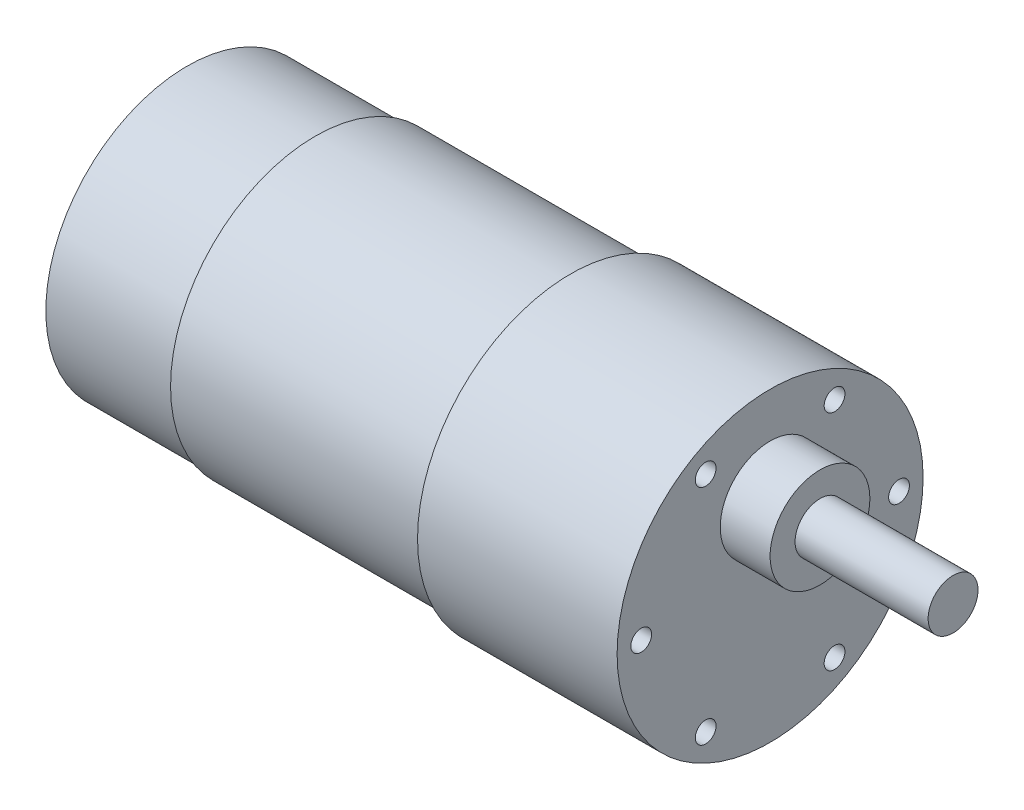
ISO-10303-21;
HEADER;
FILE_DESCRIPTION(('STEP AP214'),'2;1');
FILE_NAME('part.step','',(''),(''),'','','');
FILE_SCHEMA(('AUTOMOTIVE_DESIGN { 1 0 10303 214 1 1 1 1 }'));
ENDSEC;
DATA;
#1=APPLICATION_CONTEXT('core data for automotive mechanical design processes');
#2=APPLICATION_PROTOCOL_DEFINITION('international standard','automotive_design',2000,#1);
#3=PRODUCT_CONTEXT('',#1,'mechanical');
#4=PRODUCT('Part','Part','',(#3));
#5=PRODUCT_RELATED_PRODUCT_CATEGORY('part','',(#4));
#6=PRODUCT_DEFINITION_FORMATION('','',#4);
#7=PRODUCT_DEFINITION_CONTEXT('part definition',#1,'design');
#8=PRODUCT_DEFINITION('design','',#6,#7);
#9=PRODUCT_DEFINITION_SHAPE('','',#8);
#10=(LENGTH_UNIT() NAMED_UNIT(*) SI_UNIT(.MILLI.,.METRE.));
#11=(NAMED_UNIT(*) PLANE_ANGLE_UNIT() SI_UNIT($,.RADIAN.));
#12=(NAMED_UNIT(*) SI_UNIT($,.STERADIAN.) SOLID_ANGLE_UNIT());
#13=UNCERTAINTY_MEASURE_WITH_UNIT(LENGTH_MEASURE(1.E-05),#10,'distance_accuracy_value','');
#14=(GEOMETRIC_REPRESENTATION_CONTEXT(3) GLOBAL_UNCERTAINTY_ASSIGNED_CONTEXT((#13)) GLOBAL_UNIT_ASSIGNED_CONTEXT((#10,
#11,#12)) REPRESENTATION_CONTEXT('',''));
#15=CARTESIAN_POINT('',(0.,0.,0.));
#16=DIRECTION('',(0.,0.,1.));
#17=DIRECTION('',(1.,0.,0.));
#18=AXIS2_PLACEMENT_3D('',#15,#16,#17);
#19=CARTESIAN_POINT('',(-24.,0.,0.));
#20=DIRECTION('',(1.,0.,0.));
#21=DIRECTION('',(0.,0.,-1.));
#22=AXIS2_PLACEMENT_3D('',#19,#20,#21);
#23=CYLINDRICAL_SURFACE('',#22,18.4);
#24=CARTESIAN_POINT('',(-24.,0.,0.));
#25=DIRECTION('',(1.,0.,0.));
#26=DIRECTION('',(0.,0.,-1.));
#27=AXIS2_PLACEMENT_3D('',#24,#25,#26);
#28=CIRCLE('',#27,18.4);
#29=CARTESIAN_POINT('',(-24.,0.,-18.4));
#30=VERTEX_POINT('',#29);
#31=EDGE_CURVE('E47',#30,#30,#28,.T.);
#32=ORIENTED_EDGE('',*,*,#31,.T.);
#33=EDGE_LOOP('',(#32));
#34=FACE_BOUND('',#33,.T.);
#35=CARTESIAN_POINT('',(0.,0.,0.));
#36=DIRECTION('',(1.,0.,0.));
#37=DIRECTION('',(0.,0.,-1.));
#38=AXIS2_PLACEMENT_3D('',#35,#36,#37);
#39=CIRCLE('',#38,18.4);
#40=CARTESIAN_POINT('',(0.,0.,-18.4));
#41=VERTEX_POINT('',#40);
#42=EDGE_CURVE('E37',#41,#41,#39,.T.);
#43=ORIENTED_EDGE('',*,*,#42,.F.);
#44=EDGE_LOOP('',(#43));
#45=FACE_BOUND('',#44,.T.);
#46=ADVANCED_FACE('F40',(#34,#45),#23,.T.);
#47=CARTESIAN_POINT('',(-24.,0.,0.));
#48=DIRECTION('',(1.,0.,0.));
#49=DIRECTION('',(0.,0.,-1.));
#50=AXIS2_PLACEMENT_3D('',#47,#48,#49);
#51=PLANE('',#50);
#52=CARTESIAN_POINT('',(-24.,0.,0.));
#53=DIRECTION('',(1.,0.,0.));
#54=DIRECTION('',(0.,0.,-1.));
#55=AXIS2_PLACEMENT_3D('',#52,#53,#54);
#56=CIRCLE('',#55,17.4);
#57=CARTESIAN_POINT('',(-24.,0.,-17.4));
#58=VERTEX_POINT('',#57);
#59=EDGE_CURVE('E61',#58,#58,#56,.T.);
#60=ORIENTED_EDGE('',*,*,#59,.T.);
#61=EDGE_LOOP('',(#60));
#62=FACE_BOUND('',#61,.T.);
#63=ORIENTED_EDGE('',*,*,#31,.F.);
#64=EDGE_LOOP('',(#63));
#65=FACE_BOUND('',#64,.T.);
#66=ADVANCED_FACE('F76',(#62,#65),#51,.F.);
#67=CARTESIAN_POINT('',(0.,0.,0.));
#68=DIRECTION('',(1.,0.,0.));
#69=DIRECTION('',(0.,0.,-1.));
#70=AXIS2_PLACEMENT_3D('',#67,#68,#69);
#71=PLANE('',#70);
#72=CARTESIAN_POINT('',(0.,0.,15.5));
#73=DIRECTION('',(1.,0.,0.));
#74=DIRECTION('',(0.,0.,-1.));
#75=AXIS2_PLACEMENT_3D('',#72,#73,#74);
#76=CIRCLE('',#75,1.25);
#77=CARTESIAN_POINT('',(0.,0.,14.25));
#78=VERTEX_POINT('',#77);
#79=EDGE_CURVE('E172',#78,#78,#76,.T.);
#80=ORIENTED_EDGE('',*,*,#79,.F.);
#81=EDGE_LOOP('',(#80));
#82=FACE_BOUND('',#81,.T.);
#83=CARTESIAN_POINT('',(0.,-13.4233937586588,7.75));
#84=DIRECTION('',(1.,0.,0.));
#85=DIRECTION('',(0.,0.,-1.));
#86=AXIS2_PLACEMENT_3D('',#83,#84,#85);
#87=CIRCLE('',#86,1.25);
#88=CARTESIAN_POINT('',(0.,-13.4233937586588,6.5));
#89=VERTEX_POINT('',#88);
#90=EDGE_CURVE('E181',#89,#89,#87,.T.);
#91=ORIENTED_EDGE('',*,*,#90,.F.);
#92=EDGE_LOOP('',(#91));
#93=FACE_BOUND('',#92,.T.);
#94=CARTESIAN_POINT('',(0.,-13.4233937586588,-7.75000000000001));
#95=DIRECTION('',(1.,0.,0.));
#96=DIRECTION('',(0.,0.,-1.));
#97=AXIS2_PLACEMENT_3D('',#94,#95,#96);
#98=CIRCLE('',#97,1.25);
#99=CARTESIAN_POINT('',(0.,-13.4233937586588,-9.00000000000001));
#100=VERTEX_POINT('',#99);
#101=EDGE_CURVE('E204',#100,#100,#98,.T.);
#102=ORIENTED_EDGE('',*,*,#101,.F.);
#103=EDGE_LOOP('',(#102));
#104=FACE_BOUND('',#103,.T.);
#105=CARTESIAN_POINT('',(0.,0.,-15.5));
#106=DIRECTION('',(1.,0.,0.));
#107=DIRECTION('',(0.,0.,-1.));
#108=AXIS2_PLACEMENT_3D('',#105,#106,#107);
#109=CIRCLE('',#108,1.25);
#110=CARTESIAN_POINT('',(0.,0.,-16.75));
#111=VERTEX_POINT('',#110);
#112=EDGE_CURVE('E197',#111,#111,#109,.T.);
#113=ORIENTED_EDGE('',*,*,#112,.F.);
#114=EDGE_LOOP('',(#113));
#115=FACE_BOUND('',#114,.T.);
#116=CARTESIAN_POINT('',(0.,13.4233937586588,-7.75));
#117=DIRECTION('',(1.,0.,0.));
#118=DIRECTION('',(0.,0.,-1.));
#119=AXIS2_PLACEMENT_3D('',#116,#117,#118);
#120=CIRCLE('',#119,1.25);
#121=CARTESIAN_POINT('',(0.,13.4233937586588,-9.));
#122=VERTEX_POINT('',#121);
#123=EDGE_CURVE('E195',#122,#122,#120,.T.);
#124=ORIENTED_EDGE('',*,*,#123,.F.);
#125=EDGE_LOOP('',(#124));
#126=FACE_BOUND('',#125,.T.);
#127=CARTESIAN_POINT('',(0.,13.4233937586588,7.75));
#128=DIRECTION('',(1.,0.,0.));
#129=DIRECTION('',(0.,0.,-1.));
#130=AXIS2_PLACEMENT_3D('',#127,#128,#129);
#131=CIRCLE('',#130,1.25);
#132=CARTESIAN_POINT('',(0.,13.4233937586588,6.5));
#133=VERTEX_POINT('',#132);
#134=EDGE_CURVE('E178',#133,#133,#131,.T.);
#135=ORIENTED_EDGE('',*,*,#134,.F.);
#136=EDGE_LOOP('',(#135));
#137=FACE_BOUND('',#136,.T.);
#138=CARTESIAN_POINT('',(0.,7.,0.));
#139=DIRECTION('',(1.,0.,0.));
#140=DIRECTION('',(0.,0.,-1.));
#141=AXIS2_PLACEMENT_3D('',#138,#139,#140);
#142=CIRCLE('',#141,6.);
#143=CARTESIAN_POINT('',(0.,7.,-6.));
#144=VERTEX_POINT('',#143);
#145=EDGE_CURVE('E42',#144,#144,#142,.T.);
#146=ORIENTED_EDGE('',*,*,#145,.F.);
#147=EDGE_LOOP('',(#146));
#148=FACE_BOUND('',#147,.T.);
#149=ORIENTED_EDGE('',*,*,#42,.T.);
#150=EDGE_LOOP('',(#149));
#151=FACE_BOUND('',#150,.T.);
#152=ADVANCED_FACE('F74',(#82,#93,#104,#115,#126,#137,#148,#151),#71,.T.);
#153=CARTESIAN_POINT('',(-54.7,0.,0.));
#154=DIRECTION('',(1.,0.,0.));
#155=DIRECTION('',(0.,0.,-1.));
#156=AXIS2_PLACEMENT_3D('',#153,#154,#155);
#157=CYLINDRICAL_SURFACE('',#156,17.4);
#158=CARTESIAN_POINT('',(-54.7,0.,0.));
#159=DIRECTION('',(1.,0.,0.));
#160=DIRECTION('',(0.,0.,-1.));
#161=AXIS2_PLACEMENT_3D('',#158,#159,#160);
#162=CIRCLE('',#161,17.4);
#163=CARTESIAN_POINT('',(-54.7,0.,-17.4));
#164=VERTEX_POINT('',#163);
#165=EDGE_CURVE('E62',#164,#164,#162,.T.);
#166=ORIENTED_EDGE('',*,*,#165,.T.);
#167=EDGE_LOOP('',(#166));
#168=FACE_BOUND('',#167,.T.);
#169=ORIENTED_EDGE('',*,*,#59,.F.);
#170=EDGE_LOOP('',(#169));
#171=FACE_BOUND('',#170,.T.);
#172=ADVANCED_FACE('F88',(#168,#171),#157,.T.);
#173=CARTESIAN_POINT('',(-54.7,0.,0.));
#174=DIRECTION('',(1.,0.,0.));
#175=DIRECTION('',(0.,0.,-1.));
#176=AXIS2_PLACEMENT_3D('',#173,#174,#175);
#177=PLANE('',#176);
#178=CARTESIAN_POINT('',(-54.7,0.,0.));
#179=DIRECTION('',(1.,0.,0.));
#180=DIRECTION('',(0.,0.,-1.));
#181=AXIS2_PLACEMENT_3D('',#178,#179,#180);
#182=CIRCLE('',#181,17.);
#183=CARTESIAN_POINT('',(-54.7,0.,-17.));
#184=VERTEX_POINT('',#183);
#185=EDGE_CURVE('E60',#184,#184,#182,.T.);
#186=ORIENTED_EDGE('',*,*,#185,.T.);
#187=EDGE_LOOP('',(#186));
#188=FACE_BOUND('',#187,.T.);
#189=ORIENTED_EDGE('',*,*,#165,.F.);
#190=EDGE_LOOP('',(#189));
#191=FACE_BOUND('',#190,.T.);
#192=ADVANCED_FACE('F93',(#188,#191),#177,.F.);
#193=CARTESIAN_POINT('',(-70.1,0.,0.));
#194=DIRECTION('',(1.,0.,0.));
#195=DIRECTION('',(0.,0.,-1.));
#196=AXIS2_PLACEMENT_3D('',#193,#194,#195);
#197=CYLINDRICAL_SURFACE('',#196,17.);
#198=CARTESIAN_POINT('',(-70.1,0.,0.));
#199=DIRECTION('',(1.,0.,0.));
#200=DIRECTION('',(0.,0.,-1.));
#201=AXIS2_PLACEMENT_3D('',#198,#199,#200);
#202=CIRCLE('',#201,17.);
#203=CARTESIAN_POINT('',(-70.1,0.,-17.));
#204=VERTEX_POINT('',#203);
#205=EDGE_CURVE('E56',#204,#204,#202,.T.);
#206=CARTESIAN_POINT('',(-70.1,0.,-17.));
#207=CARTESIAN_POINT('',(-69.9395833333333,0.,-17.));
#208=CARTESIAN_POINT('',(-69.7791666666667,0.,-17.));
#209=CARTESIAN_POINT('',(-69.4583333333334,0.,-17.));
#210=CARTESIAN_POINT('',(-69.2979166666667,0.,-17.));
#211=CARTESIAN_POINT('',(-68.9770833333334,0.,-17.));
#212=CARTESIAN_POINT('',(-68.8166666666667,0.,-17.));
#213=CARTESIAN_POINT('',(-68.4958333333334,0.,-17.));
#214=CARTESIAN_POINT('',(-68.3354166666667,0.,-17.));
#215=CARTESIAN_POINT('',(-68.0145833333333,0.,-17.));
#216=CARTESIAN_POINT('',(-67.8541666666667,0.,-17.));
#217=CARTESIAN_POINT('',(-67.5333333333333,0.,-17.));
#218=CARTESIAN_POINT('',(-67.3729166666667,0.,-17.));
#219=CARTESIAN_POINT('',(-67.0520833333333,0.,-17.));
#220=CARTESIAN_POINT('',(-66.8916666666667,0.,-17.));
#221=CARTESIAN_POINT('',(-66.5708333333334,0.,-17.));
#222=CARTESIAN_POINT('',(-66.4104166666667,0.,-17.));
#223=CARTESIAN_POINT('',(-66.0895833333334,0.,-17.));
#224=CARTESIAN_POINT('',(-65.9291666666667,0.,-17.));
#225=CARTESIAN_POINT('',(-65.6083333333333,0.,-17.));
#226=CARTESIAN_POINT('',(-65.4479166666667,0.,-17.));
#227=CARTESIAN_POINT('',(-65.1270833333333,0.,-17.));
#228=CARTESIAN_POINT('',(-64.9666666666667,0.,-17.));
#229=CARTESIAN_POINT('',(-64.6458333333333,0.,-17.));
#230=CARTESIAN_POINT('',(-64.4854166666667,0.,-17.));
#231=CARTESIAN_POINT('',(-64.1645833333333,0.,-17.));
#232=CARTESIAN_POINT('',(-64.0041666666667,0.,-17.));
#233=CARTESIAN_POINT('',(-63.6833333333334,0.,-17.));
#234=CARTESIAN_POINT('',(-63.5229166666667,0.,-17.));
#235=CARTESIAN_POINT('',(-63.2020833333334,0.,-17.));
#236=CARTESIAN_POINT('',(-63.0416666666667,0.,-17.));
#237=CARTESIAN_POINT('',(-62.7208333333334,0.,-17.));
#238=CARTESIAN_POINT('',(-62.5604166666667,0.,-17.));
#239=CARTESIAN_POINT('',(-62.2395833333333,0.,-17.));
#240=CARTESIAN_POINT('',(-62.0791666666667,0.,-17.));
#241=CARTESIAN_POINT('',(-61.7583333333333,0.,-17.));
#242=CARTESIAN_POINT('',(-61.5979166666667,0.,-17.));
#243=CARTESIAN_POINT('',(-61.2770833333333,0.,-17.));
#244=CARTESIAN_POINT('',(-61.1166666666667,0.,-17.));
#245=CARTESIAN_POINT('',(-60.7958333333333,0.,-17.));
#246=CARTESIAN_POINT('',(-60.6354166666667,0.,-17.));
#247=CARTESIAN_POINT('',(-60.3145833333333,0.,-17.));
#248=CARTESIAN_POINT('',(-60.1541666666667,0.,-17.));
#249=CARTESIAN_POINT('',(-59.8333333333333,0.,-17.));
#250=CARTESIAN_POINT('',(-59.6729166666667,0.,-17.));
#251=CARTESIAN_POINT('',(-59.3520833333333,0.,-17.));
#252=CARTESIAN_POINT('',(-59.1916666666667,0.,-17.));
#253=CARTESIAN_POINT('',(-58.8708333333333,0.,-17.));
#254=CARTESIAN_POINT('',(-58.7104166666667,0.,-17.));
#255=CARTESIAN_POINT('',(-58.3895833333333,0.,-17.));
#256=CARTESIAN_POINT('',(-58.2291666666667,0.,-17.));
#257=CARTESIAN_POINT('',(-57.9083333333333,0.,-17.));
#258=CARTESIAN_POINT('',(-57.7479166666667,0.,-17.));
#259=CARTESIAN_POINT('',(-57.4270833333333,0.,-17.));
#260=CARTESIAN_POINT('',(-57.2666666666667,0.,-17.));
#261=CARTESIAN_POINT('',(-56.9458333333333,0.,-17.));
#262=CARTESIAN_POINT('',(-56.7854166666667,0.,-17.));
#263=CARTESIAN_POINT('',(-56.4645833333333,0.,-17.));
#264=CARTESIAN_POINT('',(-56.3041666666667,0.,-17.));
#265=CARTESIAN_POINT('',(-55.9833333333333,0.,-17.));
#266=CARTESIAN_POINT('',(-55.8229166666667,0.,-17.));
#267=CARTESIAN_POINT('',(-55.5020833333333,0.,-17.));
#268=CARTESIAN_POINT('',(-55.3416666666667,0.,-17.));
#269=CARTESIAN_POINT('',(-55.0208333333333,0.,-17.));
#270=CARTESIAN_POINT('',(-54.8604166666667,0.,-17.));
#271=CARTESIAN_POINT('',(-54.7,0.,-17.));
#272=B_SPLINE_CURVE_WITH_KNOTS('',3,(#206,#207,#208,#209,#210,#211,#212,#213,#214,#215,#216,
#217,#218,#219,#220,#221,#222,#223,#224,#225,#226,#227,#228,#229,#230,#231,#232,#233,#234,#235,
#236,#237,#238,#239,#240,#241,#242,#243,#244,#245,#246,#247,#248,#249,#250,#251,#252,#253,#254,
#255,#256,#257,#258,#259,#260,#261,#262,#263,#264,#265,#266,#267,#268,#269,#270,#271),
.UNSPECIFIED.,.F.,.F.,(4,2,2,2,2,2,2,2,2,2,2,2,2,2,2,2,2,2,2,2,2,2,2,2,2,2,2,2,2,2,2,2,4),(0.,
0.481249999999989,0.962499999999991,1.44374999999999,1.925,2.40625,2.8875,3.36874999999999,
3.84999999999999,4.33124999999999,4.8125,5.29375,5.775,6.25624999999999,6.73749999999999,
7.21875,7.7,8.18125,8.6625,9.14375,9.62499999999999,10.10625,10.5875,11.06875,11.55,12.03125,
12.5125,12.99375,13.475,13.95625,14.4375,14.91875,15.4),.UNSPECIFIED.);
#273=EDGE_CURVE('BSEAM97',#204,#184,#272,.T.);
#274=ORIENTED_EDGE('',*,*,#205,.T.);
#275=ORIENTED_EDGE('',*,*,#185,.F.);
#276=ORIENTED_EDGE('',*,*,#273,.T.);
#277=ORIENTED_EDGE('',*,*,#273,.F.);
#278=EDGE_LOOP('',(#274,#276,#275,#277));
#279=FACE_BOUND('',#278,.T.);
#280=ADVANCED_FACE('F97',(#279),#197,.T.);
#281=CARTESIAN_POINT('',(-70.1,0.,0.));
#282=DIRECTION('',(1.,0.,0.));
#283=DIRECTION('',(0.,0.,-1.));
#284=AXIS2_PLACEMENT_3D('',#281,#282,#283);
#285=PLANE('',#284);
#286=ORIENTED_EDGE('',*,*,#205,.F.);
#287=EDGE_LOOP('',(#286));
#288=FACE_BOUND('',#287,.T.);
#289=ADVANCED_FACE('F103',(#288),#285,.F.);
#290=CARTESIAN_POINT('',(6.,7.,0.));
#291=DIRECTION('',(-1.,0.,0.));
#292=DIRECTION('',(0.,0.,1.));
#293=AXIS2_PLACEMENT_3D('',#290,#291,#292);
#294=CYLINDRICAL_SURFACE('',#293,6.);
#295=CARTESIAN_POINT('',(6.,7.,0.));
#296=DIRECTION('',(1.,0.,0.));
#297=DIRECTION('',(0.,0.,-1.));
#298=AXIS2_PLACEMENT_3D('',#295,#296,#297);
#299=CIRCLE('',#298,6.);
#300=CARTESIAN_POINT('',(6.,7.,-6.));
#301=VERTEX_POINT('',#300);
#302=EDGE_CURVE('E54',#301,#301,#299,.T.);
#303=ORIENTED_EDGE('',*,*,#302,.F.);
#304=EDGE_LOOP('',(#303));
#305=FACE_BOUND('',#304,.T.);
#306=ORIENTED_EDGE('',*,*,#145,.T.);
#307=EDGE_LOOP('',(#306));
#308=FACE_BOUND('',#307,.T.);
#309=ADVANCED_FACE('F102',(#305,#308),#294,.T.);
#310=CARTESIAN_POINT('',(6.,7.,0.));
#311=DIRECTION('',(1.,0.,0.));
#312=DIRECTION('',(0.,0.,-1.));
#313=AXIS2_PLACEMENT_3D('',#310,#311,#312);
#314=PLANE('',#313);
#315=CARTESIAN_POINT('',(6.,7.,0.));
#316=DIRECTION('',(1.,0.,0.));
#317=DIRECTION('',(0.,0.,-1.));
#318=AXIS2_PLACEMENT_3D('',#315,#316,#317);
#319=CIRCLE('',#318,3.);
#320=CARTESIAN_POINT('',(6.,7.,-3.));
#321=VERTEX_POINT('',#320);
#322=EDGE_CURVE('E10',#321,#321,#319,.T.);
#323=ORIENTED_EDGE('',*,*,#322,.F.);
#324=EDGE_LOOP('',(#323));
#325=FACE_BOUND('',#324,.T.);
#326=ORIENTED_EDGE('',*,*,#302,.T.);
#327=EDGE_LOOP('',(#326));
#328=FACE_BOUND('',#327,.T.);
#329=ADVANCED_FACE('F107',(#325,#328),#314,.T.);
#330=CARTESIAN_POINT('',(22.,7.,0.));
#331=DIRECTION('',(-1.,0.,0.));
#332=DIRECTION('',(0.,0.,1.));
#333=AXIS2_PLACEMENT_3D('',#330,#331,#332);
#334=CYLINDRICAL_SURFACE('',#333,3.);
#335=CARTESIAN_POINT('',(22.,7.,0.));
#336=DIRECTION('',(1.,0.,0.));
#337=DIRECTION('',(0.,0.,-1.));
#338=AXIS2_PLACEMENT_3D('',#335,#336,#337);
#339=CIRCLE('',#338,3.);
#340=CARTESIAN_POINT('',(22.,7.,-3.));
#341=VERTEX_POINT('',#340);
#342=EDGE_CURVE('E52',#341,#341,#339,.T.);
#343=ORIENTED_EDGE('',*,*,#342,.F.);
#344=EDGE_LOOP('',(#343));
#345=FACE_BOUND('',#344,.T.);
#346=ORIENTED_EDGE('',*,*,#322,.T.);
#347=EDGE_LOOP('',(#346));
#348=FACE_BOUND('',#347,.T.);
#349=ADVANCED_FACE('F113',(#345,#348),#334,.T.);
#350=CARTESIAN_POINT('',(22.,7.,0.));
#351=DIRECTION('',(1.,0.,0.));
#352=DIRECTION('',(0.,0.,-1.));
#353=AXIS2_PLACEMENT_3D('',#350,#351,#352);
#354=PLANE('',#353);
#355=ORIENTED_EDGE('',*,*,#342,.T.);
#356=EDGE_LOOP('',(#355));
#357=FACE_BOUND('',#356,.T.);
#358=ADVANCED_FACE('F120',(#357),#354,.T.);
#359=CARTESIAN_POINT('',(-3.,13.4233937586588,7.75));
#360=DIRECTION('',(1.,0.,0.));
#361=DIRECTION('',(0.,0.,-1.));
#362=AXIS2_PLACEMENT_3D('',#359,#360,#361);
#363=CYLINDRICAL_SURFACE('',#362,1.25);
#364=CARTESIAN_POINT('',(-3.,13.4233937586588,7.75));
#365=DIRECTION('',(1.,0.,0.));
#366=DIRECTION('',(0.,0.,-1.));
#367=AXIS2_PLACEMENT_3D('',#364,#365,#366);
#368=CIRCLE('',#367,1.25);
#369=CARTESIAN_POINT('',(-3.,13.4233937586588,6.5));
#370=VERTEX_POINT('',#369);
#371=EDGE_CURVE('E188',#370,#370,#368,.T.);
#372=ORIENTED_EDGE('',*,*,#371,.F.);
#373=EDGE_LOOP('',(#372));
#374=FACE_BOUND('',#373,.T.);
#375=ORIENTED_EDGE('',*,*,#134,.T.);
#376=EDGE_LOOP('',(#375));
#377=FACE_BOUND('',#376,.T.);
#378=ADVANCED_FACE('F122',(#374,#377),#363,.F.);
#379=CARTESIAN_POINT('',(-3.,13.4233937586588,7.75));
#380=DIRECTION('',(1.,0.,0.));
#381=DIRECTION('',(0.,0.,-1.));
#382=AXIS2_PLACEMENT_3D('',#379,#380,#381);
#383=PLANE('',#382);
#384=ORIENTED_EDGE('',*,*,#371,.T.);
#385=EDGE_LOOP('',(#384));
#386=FACE_BOUND('',#385,.T.);
#387=ADVANCED_FACE('F146',(#386),#383,.T.);
#388=CARTESIAN_POINT('',(-3.,13.4233937586588,-7.75));
#389=DIRECTION('',(1.,0.,0.));
#390=DIRECTION('',(0.,0.,-1.));
#391=AXIS2_PLACEMENT_3D('',#388,#389,#390);
#392=CYLINDRICAL_SURFACE('',#391,1.25);
#393=CARTESIAN_POINT('',(-3.,13.4233937586588,-7.75));
#394=DIRECTION('',(1.,0.,0.));
#395=DIRECTION('',(0.,0.,-1.));
#396=AXIS2_PLACEMENT_3D('',#393,#394,#395);
#397=CIRCLE('',#396,1.25);
#398=CARTESIAN_POINT('',(-3.,13.4233937586588,-9.));
#399=VERTEX_POINT('',#398);
#400=EDGE_CURVE('E196',#399,#399,#397,.T.);
#401=ORIENTED_EDGE('',*,*,#400,.F.);
#402=EDGE_LOOP('',(#401));
#403=FACE_BOUND('',#402,.T.);
#404=ORIENTED_EDGE('',*,*,#123,.T.);
#405=EDGE_LOOP('',(#404));
#406=FACE_BOUND('',#405,.T.);
#407=ADVANCED_FACE('F141',(#403,#406),#392,.F.);
#408=CARTESIAN_POINT('',(-3.,13.4233937586588,-7.75));
#409=DIRECTION('',(1.,0.,0.));
#410=DIRECTION('',(0.,0.,-1.));
#411=AXIS2_PLACEMENT_3D('',#408,#409,#410);
#412=PLANE('',#411);
#413=ORIENTED_EDGE('',*,*,#400,.T.);
#414=EDGE_LOOP('',(#413));
#415=FACE_BOUND('',#414,.T.);
#416=ADVANCED_FACE('F137',(#415),#412,.T.);
#417=CARTESIAN_POINT('',(-3.,0.,-15.5));
#418=DIRECTION('',(1.,0.,0.));
#419=DIRECTION('',(0.,0.,-1.));
#420=AXIS2_PLACEMENT_3D('',#417,#418,#419);
#421=CYLINDRICAL_SURFACE('',#420,1.25);
#422=CARTESIAN_POINT('',(-3.,0.,-15.5));
#423=DIRECTION('',(1.,0.,0.));
#424=DIRECTION('',(0.,0.,-1.));
#425=AXIS2_PLACEMENT_3D('',#422,#423,#424);
#426=CIRCLE('',#425,1.25);
#427=CARTESIAN_POINT('',(-3.,0.,-16.75));
#428=VERTEX_POINT('',#427);
#429=EDGE_CURVE('E205',#428,#428,#426,.T.);
#430=ORIENTED_EDGE('',*,*,#429,.F.);
#431=EDGE_LOOP('',(#430));
#432=FACE_BOUND('',#431,.T.);
#433=ORIENTED_EDGE('',*,*,#112,.T.);
#434=EDGE_LOOP('',(#433));
#435=FACE_BOUND('',#434,.T.);
#436=ADVANCED_FACE('F134',(#432,#435),#421,.F.);
#437=CARTESIAN_POINT('',(-3.,0.,-15.5));
#438=DIRECTION('',(1.,0.,0.));
#439=DIRECTION('',(0.,0.,-1.));
#440=AXIS2_PLACEMENT_3D('',#437,#438,#439);
#441=PLANE('',#440);
#442=ORIENTED_EDGE('',*,*,#429,.T.);
#443=EDGE_LOOP('',(#442));
#444=FACE_BOUND('',#443,.T.);
#445=ADVANCED_FACE('F131',(#444),#441,.T.);
#446=CARTESIAN_POINT('',(-3.,-13.4233937586588,-7.75000000000001));
#447=DIRECTION('',(1.,0.,0.));
#448=DIRECTION('',(0.,0.,-1.));
#449=AXIS2_PLACEMENT_3D('',#446,#447,#448);
#450=CYLINDRICAL_SURFACE('',#449,1.25);
#451=CARTESIAN_POINT('',(-3.,-13.4233937586588,-7.75000000000001));
#452=DIRECTION('',(1.,0.,0.));
#453=DIRECTION('',(0.,0.,-1.));
#454=AXIS2_PLACEMENT_3D('',#451,#452,#453);
#455=CIRCLE('',#454,1.25);
#456=CARTESIAN_POINT('',(-3.,-13.4233937586588,-9.00000000000001));
#457=VERTEX_POINT('',#456);
#458=EDGE_CURVE('E183',#457,#457,#455,.T.);
#459=ORIENTED_EDGE('',*,*,#458,.F.);
#460=EDGE_LOOP('',(#459));
#461=FACE_BOUND('',#460,.T.);
#462=ORIENTED_EDGE('',*,*,#101,.T.);
#463=EDGE_LOOP('',(#462));
#464=FACE_BOUND('',#463,.T.);
#465=ADVANCED_FACE('F126',(#461,#464),#450,.F.);
#466=CARTESIAN_POINT('',(-3.,-13.4233937586588,-7.75000000000001));
#467=DIRECTION('',(1.,0.,0.));
#468=DIRECTION('',(0.,0.,-1.));
#469=AXIS2_PLACEMENT_3D('',#466,#467,#468);
#470=PLANE('',#469);
#471=ORIENTED_EDGE('',*,*,#458,.T.);
#472=EDGE_LOOP('',(#471));
#473=FACE_BOUND('',#472,.T.);
#474=ADVANCED_FACE('F124',(#473),#470,.T.);
#475=CARTESIAN_POINT('',(-3.,-13.4233937586588,7.75));
#476=DIRECTION('',(1.,0.,0.));
#477=DIRECTION('',(0.,0.,-1.));
#478=AXIS2_PLACEMENT_3D('',#475,#476,#477);
#479=CYLINDRICAL_SURFACE('',#478,1.25);
#480=CARTESIAN_POINT('',(-3.,-13.4233937586588,7.75));
#481=DIRECTION('',(1.,0.,0.));
#482=DIRECTION('',(0.,0.,-1.));
#483=AXIS2_PLACEMENT_3D('',#480,#481,#482);
#484=CIRCLE('',#483,1.25);
#485=CARTESIAN_POINT('',(-3.,-13.4233937586588,6.5));
#486=VERTEX_POINT('',#485);
#487=EDGE_CURVE('E184',#486,#486,#484,.T.);
#488=ORIENTED_EDGE('',*,*,#487,.F.);
#489=EDGE_LOOP('',(#488));
#490=FACE_BOUND('',#489,.T.);
#491=ORIENTED_EDGE('',*,*,#90,.T.);
#492=EDGE_LOOP('',(#491));
#493=FACE_BOUND('',#492,.T.);
#494=ADVANCED_FACE('F129',(#490,#493),#479,.F.);
#495=CARTESIAN_POINT('',(-3.,-13.4233937586588,7.75));
#496=DIRECTION('',(1.,0.,0.));
#497=DIRECTION('',(0.,0.,-1.));
#498=AXIS2_PLACEMENT_3D('',#495,#496,#497);
#499=PLANE('',#498);
#500=ORIENTED_EDGE('',*,*,#487,.T.);
#501=EDGE_LOOP('',(#500));
#502=FACE_BOUND('',#501,.T.);
#503=ADVANCED_FACE('F154',(#502),#499,.T.);
#504=CARTESIAN_POINT('',(-3.,0.,15.5));
#505=DIRECTION('',(1.,0.,0.));
#506=DIRECTION('',(0.,0.,-1.));
#507=AXIS2_PLACEMENT_3D('',#504,#505,#506);
#508=CYLINDRICAL_SURFACE('',#507,1.25);
#509=CARTESIAN_POINT('',(-3.,0.,15.5));
#510=DIRECTION('',(1.,0.,0.));
#511=DIRECTION('',(0.,0.,-1.));
#512=AXIS2_PLACEMENT_3D('',#509,#510,#511);
#513=CIRCLE('',#512,1.25);
#514=CARTESIAN_POINT('',(-3.,0.,14.25));
#515=VERTEX_POINT('',#514);
#516=EDGE_CURVE('E173',#515,#515,#513,.T.);
#517=ORIENTED_EDGE('',*,*,#516,.F.);
#518=EDGE_LOOP('',(#517));
#519=FACE_BOUND('',#518,.T.);
#520=ORIENTED_EDGE('',*,*,#79,.T.);
#521=EDGE_LOOP('',(#520));
#522=FACE_BOUND('',#521,.T.);
#523=ADVANCED_FACE('F158',(#519,#522),#508,.F.);
#524=CARTESIAN_POINT('',(-3.,0.,15.5));
#525=DIRECTION('',(1.,0.,0.));
#526=DIRECTION('',(0.,0.,-1.));
#527=AXIS2_PLACEMENT_3D('',#524,#525,#526);
#528=PLANE('',#527);
#529=ORIENTED_EDGE('',*,*,#516,.T.);
#530=EDGE_LOOP('',(#529));
#531=FACE_BOUND('',#530,.T.);
#532=ADVANCED_FACE('F164',(#531),#528,.T.);
#533=CLOSED_SHELL('',(#46,#66,#152,#172,#192,#280,#289,#309,#329,#349,#358,#378,#387,#407,#416,
#436,#445,#465,#474,#494,#503,#523,#532));
#534=MANIFOLD_SOLID_BREP('B2',#533);
#535=ADVANCED_BREP_SHAPE_REPRESENTATION('',(#18,#534),#14);
#536=SHAPE_DEFINITION_REPRESENTATION(#9,#535);
ENDSEC;
END-ISO-10303-21;
